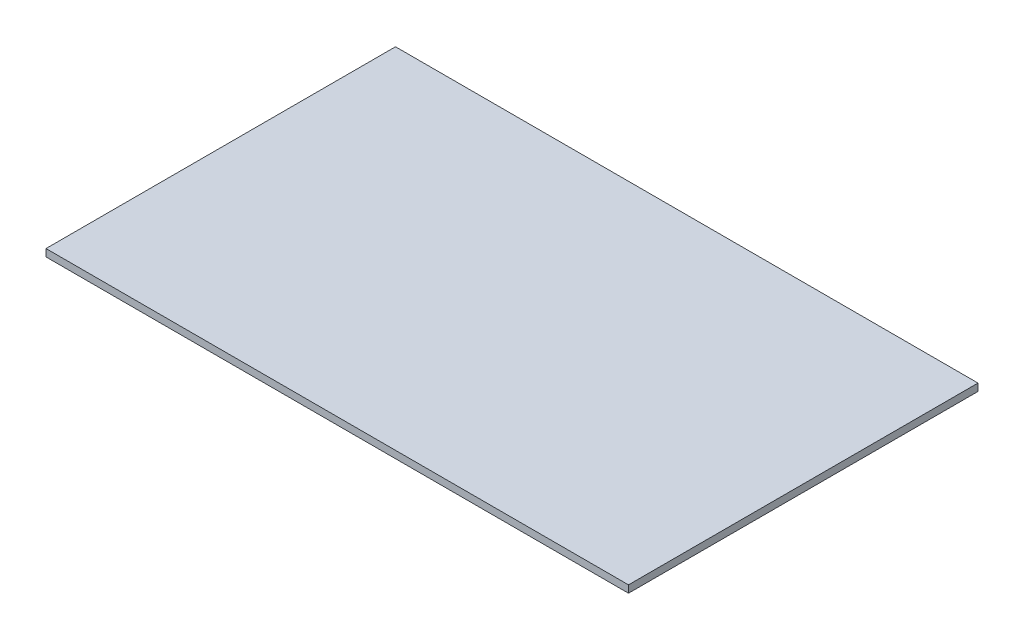
ISO-10303-21;
HEADER;
FILE_DESCRIPTION(('STEP AP214'),'2;1');
FILE_NAME('part.step','',(''),(''),'','','');
FILE_SCHEMA(('AUTOMOTIVE_DESIGN { 1 0 10303 214 1 1 1 1 }'));
ENDSEC;
DATA;
#1=APPLICATION_CONTEXT('core data for automotive mechanical design processes');
#2=APPLICATION_PROTOCOL_DEFINITION('international standard','automotive_design',2000,#1);
#3=PRODUCT_CONTEXT('',#1,'mechanical');
#4=PRODUCT('Part','Part','',(#3));
#5=PRODUCT_RELATED_PRODUCT_CATEGORY('part','',(#4));
#6=PRODUCT_DEFINITION_FORMATION('','',#4);
#7=PRODUCT_DEFINITION_CONTEXT('part definition',#1,'design');
#8=PRODUCT_DEFINITION('design','',#6,#7);
#9=PRODUCT_DEFINITION_SHAPE('','',#8);
#10=(LENGTH_UNIT() NAMED_UNIT(*) SI_UNIT(.MILLI.,.METRE.));
#11=(NAMED_UNIT(*) PLANE_ANGLE_UNIT() SI_UNIT($,.RADIAN.));
#12=(NAMED_UNIT(*) SI_UNIT($,.STERADIAN.) SOLID_ANGLE_UNIT());
#13=UNCERTAINTY_MEASURE_WITH_UNIT(LENGTH_MEASURE(1.E-05),#10,'distance_accuracy_value','');
#14=(GEOMETRIC_REPRESENTATION_CONTEXT(3) GLOBAL_UNCERTAINTY_ASSIGNED_CONTEXT((#13)) GLOBAL_UNIT_ASSIGNED_CONTEXT((#10,
#11,#12)) REPRESENTATION_CONTEXT('',''));
#15=CARTESIAN_POINT('',(0.,0.,0.));
#16=DIRECTION('',(0.,0.,1.));
#17=DIRECTION('',(1.,0.,0.));
#18=AXIS2_PLACEMENT_3D('',#15,#16,#17);
#19=CARTESIAN_POINT('',(400.,5.,-240.));
#20=DIRECTION('',(-1.,0.,0.));
#21=DIRECTION('',(0.,0.,1.));
#22=AXIS2_PLACEMENT_3D('',#19,#20,#21);
#23=PLANE('',#22);
#24=DIRECTION('',(0.,0.,-1.));
#25=VECTOR('',#24,1.);
#26=CARTESIAN_POINT('',(400.,-5.,-240.));
#27=LINE('',#26,#25);
#28=CARTESIAN_POINT('',(400.,-5.,240.));
#29=VERTEX_POINT('',#28);
#30=CARTESIAN_POINT('',(400.,-5.,-240.));
#31=VERTEX_POINT('',#30);
#32=EDGE_CURVE('E96',#29,#31,#27,.T.);
#33=ORIENTED_EDGE('',*,*,#32,.T.);
#34=DIRECTION('',(0.,-1.,0.));
#35=VECTOR('',#34,1.);
#36=CARTESIAN_POINT('',(400.,5.,-240.));
#37=LINE('',#36,#35);
#38=CARTESIAN_POINT('',(400.,5.,-240.));
#39=VERTEX_POINT('',#38);
#40=EDGE_CURVE('E11',#39,#31,#37,.T.);
#41=ORIENTED_EDGE('',*,*,#40,.F.);
#42=DIRECTION('',(0.,0.,-1.));
#43=VECTOR('',#42,1.);
#44=CARTESIAN_POINT('',(400.,5.,-240.));
#45=LINE('',#44,#43);
#46=CARTESIAN_POINT('',(400.,5.,240.));
#47=VERTEX_POINT('',#46);
#48=EDGE_CURVE('E84',#47,#39,#45,.T.);
#49=ORIENTED_EDGE('',*,*,#48,.F.);
#50=DIRECTION('',(0.,-1.,0.));
#51=VECTOR('',#50,1.);
#52=CARTESIAN_POINT('',(400.,5.,240.));
#53=LINE('',#52,#51);
#54=EDGE_CURVE('E92',#47,#29,#53,.T.);
#55=ORIENTED_EDGE('',*,*,#54,.T.);
#56=EDGE_LOOP('',(#33,#41,#49,#55));
#57=FACE_BOUND('',#56,.T.);
#58=ADVANCED_FACE('F33',(#57),#23,.F.);
#59=CARTESIAN_POINT('',(-400.,5.,-240.));
#60=DIRECTION('',(0.,0.,1.));
#61=DIRECTION('',(1.,0.,0.));
#62=AXIS2_PLACEMENT_3D('',#59,#60,#61);
#63=PLANE('',#62);
#64=DIRECTION('',(-1.,0.,0.));
#65=VECTOR('',#64,1.);
#66=CARTESIAN_POINT('',(-400.,-5.,-240.));
#67=LINE('',#66,#65);
#68=CARTESIAN_POINT('',(-400.,-5.,-240.));
#69=VERTEX_POINT('',#68);
#70=EDGE_CURVE('E88',#31,#69,#67,.T.);
#71=ORIENTED_EDGE('',*,*,#70,.T.);
#72=DIRECTION('',(0.,-1.,0.));
#73=VECTOR('',#72,1.);
#74=CARTESIAN_POINT('',(-400.,5.,-240.));
#75=LINE('',#74,#73);
#76=CARTESIAN_POINT('',(-400.,5.,-240.));
#77=VERTEX_POINT('',#76);
#78=EDGE_CURVE('E41',#77,#69,#75,.T.);
#79=ORIENTED_EDGE('',*,*,#78,.F.);
#80=DIRECTION('',(-1.,0.,0.));
#81=VECTOR('',#80,1.);
#82=CARTESIAN_POINT('',(-400.,5.,-240.));
#83=LINE('',#82,#81);
#84=EDGE_CURVE('E79',#39,#77,#83,.T.);
#85=ORIENTED_EDGE('',*,*,#84,.F.);
#86=ORIENTED_EDGE('',*,*,#40,.T.);
#87=EDGE_LOOP('',(#71,#79,#85,#86));
#88=FACE_BOUND('',#87,.T.);
#89=ADVANCED_FACE('F87',(#88),#63,.F.);
#90=CARTESIAN_POINT('',(-400.,5.,-240.));
#91=DIRECTION('',(1.,0.,0.));
#92=DIRECTION('',(0.,0.,-1.));
#93=AXIS2_PLACEMENT_3D('',#90,#91,#92);
#94=PLANE('',#93);
#95=DIRECTION('',(0.,0.,1.));
#96=VECTOR('',#95,1.);
#97=CARTESIAN_POINT('',(-400.,-5.,-240.));
#98=LINE('',#97,#96);
#99=CARTESIAN_POINT('',(-400.,-5.,240.));
#100=VERTEX_POINT('',#99);
#101=EDGE_CURVE('E66',#69,#100,#98,.T.);
#102=ORIENTED_EDGE('',*,*,#101,.T.);
#103=DIRECTION('',(0.,-1.,0.));
#104=VECTOR('',#103,1.);
#105=CARTESIAN_POINT('',(-400.,5.,240.));
#106=LINE('',#105,#104);
#107=CARTESIAN_POINT('',(-400.,5.,240.));
#108=VERTEX_POINT('',#107);
#109=EDGE_CURVE('E89',#108,#100,#106,.T.);
#110=ORIENTED_EDGE('',*,*,#109,.F.);
#111=DIRECTION('',(0.,0.,1.));
#112=VECTOR('',#111,1.);
#113=CARTESIAN_POINT('',(-400.,5.,-240.));
#114=LINE('',#113,#112);
#115=EDGE_CURVE('E82',#77,#108,#114,.T.);
#116=ORIENTED_EDGE('',*,*,#115,.F.);
#117=ORIENTED_EDGE('',*,*,#78,.T.);
#118=EDGE_LOOP('',(#102,#110,#116,#117));
#119=FACE_BOUND('',#118,.T.);
#120=ADVANCED_FACE('F90',(#119),#94,.F.);
#121=CARTESIAN_POINT('',(-400.,5.,240.));
#122=DIRECTION('',(0.,0.,-1.));
#123=DIRECTION('',(-1.,0.,0.));
#124=AXIS2_PLACEMENT_3D('',#121,#122,#123);
#125=PLANE('',#124);
#126=DIRECTION('',(1.,0.,0.));
#127=VECTOR('',#126,1.);
#128=CARTESIAN_POINT('',(-400.,-5.,240.));
#129=LINE('',#128,#127);
#130=EDGE_CURVE('E72',#100,#29,#129,.T.);
#131=ORIENTED_EDGE('',*,*,#130,.T.);
#132=ORIENTED_EDGE('',*,*,#54,.F.);
#133=DIRECTION('',(1.,0.,0.));
#134=VECTOR('',#133,1.);
#135=CARTESIAN_POINT('',(-400.,5.,240.));
#136=LINE('',#135,#134);
#137=EDGE_CURVE('E49',#108,#47,#136,.T.);
#138=ORIENTED_EDGE('',*,*,#137,.F.);
#139=ORIENTED_EDGE('',*,*,#109,.T.);
#140=EDGE_LOOP('',(#131,#132,#138,#139));
#141=FACE_BOUND('',#140,.T.);
#142=ADVANCED_FACE('F103',(#141),#125,.F.);
#143=CARTESIAN_POINT('',(0.,5.,0.));
#144=DIRECTION('',(0.,1.,0.));
#145=DIRECTION('',(0.,0.,1.));
#146=AXIS2_PLACEMENT_3D('',#143,#144,#145);
#147=PLANE('',#146);
#148=ORIENTED_EDGE('',*,*,#48,.T.);
#149=ORIENTED_EDGE('',*,*,#84,.T.);
#150=ORIENTED_EDGE('',*,*,#115,.T.);
#151=ORIENTED_EDGE('',*,*,#137,.T.);
#152=EDGE_LOOP('',(#148,#149,#150,#151));
#153=FACE_BOUND('',#152,.T.);
#154=ADVANCED_FACE('F80',(#153),#147,.T.);
#155=CARTESIAN_POINT('',(0.,-5.,0.));
#156=DIRECTION('',(0.,1.,0.));
#157=DIRECTION('',(0.,0.,1.));
#158=AXIS2_PLACEMENT_3D('',#155,#156,#157);
#159=PLANE('',#158);
#160=ORIENTED_EDGE('',*,*,#32,.F.);
#161=ORIENTED_EDGE('',*,*,#130,.F.);
#162=ORIENTED_EDGE('',*,*,#101,.F.);
#163=ORIENTED_EDGE('',*,*,#70,.F.);
#164=EDGE_LOOP('',(#160,#161,#162,#163));
#165=FACE_BOUND('',#164,.T.);
#166=ADVANCED_FACE('F106',(#165),#159,.F.);
#167=CLOSED_SHELL('',(#58,#89,#120,#142,#154,#166));
#168=MANIFOLD_SOLID_BREP('B2',#167);
#169=ADVANCED_BREP_SHAPE_REPRESENTATION('',(#18,#168),#14);
#170=SHAPE_DEFINITION_REPRESENTATION(#9,#169);
ENDSEC;
END-ISO-10303-21;
